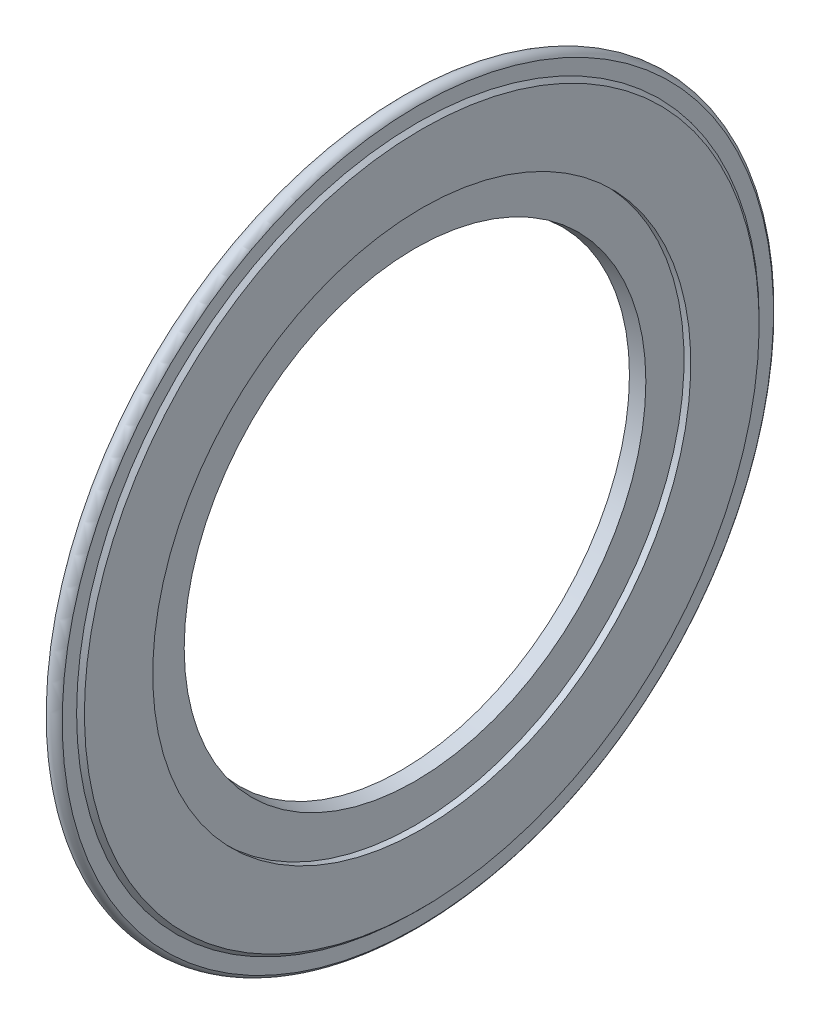
ISO-10303-21;
HEADER;
FILE_DESCRIPTION(('STEP AP214'),'2;1');
FILE_NAME('part.step','',(''),(''),'','','');
FILE_SCHEMA(('AUTOMOTIVE_DESIGN { 1 0 10303 214 1 1 1 1 }'));
ENDSEC;
DATA;
#1=APPLICATION_CONTEXT('core data for automotive mechanical design processes');
#2=APPLICATION_PROTOCOL_DEFINITION('international standard','automotive_design',2000,#1);
#3=PRODUCT_CONTEXT('',#1,'mechanical');
#4=PRODUCT('Part','Part','',(#3));
#5=PRODUCT_RELATED_PRODUCT_CATEGORY('part','',(#4));
#6=PRODUCT_DEFINITION_FORMATION('','',#4);
#7=PRODUCT_DEFINITION_CONTEXT('part definition',#1,'design');
#8=PRODUCT_DEFINITION('design','',#6,#7);
#9=PRODUCT_DEFINITION_SHAPE('','',#8);
#10=(LENGTH_UNIT() NAMED_UNIT(*) SI_UNIT(.MILLI.,.METRE.));
#11=(NAMED_UNIT(*) PLANE_ANGLE_UNIT() SI_UNIT($,.RADIAN.));
#12=(NAMED_UNIT(*) SI_UNIT($,.STERADIAN.) SOLID_ANGLE_UNIT());
#13=UNCERTAINTY_MEASURE_WITH_UNIT(LENGTH_MEASURE(1.E-05),#10,'distance_accuracy_value','');
#14=(GEOMETRIC_REPRESENTATION_CONTEXT(3) GLOBAL_UNCERTAINTY_ASSIGNED_CONTEXT((#13)) GLOBAL_UNIT_ASSIGNED_CONTEXT((#10,
#11,#12)) REPRESENTATION_CONTEXT('',''));
#15=CARTESIAN_POINT('',(0.,0.,0.));
#16=DIRECTION('',(0.,0.,1.));
#17=DIRECTION('',(1.,0.,0.));
#18=AXIS2_PLACEMENT_3D('',#15,#16,#17);
#19=CARTESIAN_POINT('',(9.31,0.,0.));
#20=DIRECTION('',(1.,0.,0.));
#21=DIRECTION('',(0.,1.,0.));
#22=AXIS2_PLACEMENT_3D('',#19,#20,#21);
#23=CONICAL_SURFACE('',#22,10.2102020929528,0.174532925199435);
#24=CARTESIAN_POINT('',(9.,0.,0.));
#25=DIRECTION('',(-1.,0.,0.));
#26=DIRECTION('',(0.,1.,0.));
#27=AXIS2_PLACEMENT_3D('',#24,#25,#26);
#28=CIRCLE('',#27,10.1555407289332);
#29=CARTESIAN_POINT('',(9.,10.1555407289332,0.));
#30=VERTEX_POINT('',#29);
#31=EDGE_CURVE('E11',#30,#30,#28,.T.);
#32=ORIENTED_EDGE('',*,*,#31,.T.);
#33=EDGE_LOOP('',(#32));
#34=FACE_BOUND('',#33,.T.);
#35=CARTESIAN_POINT('',(9.62,0.,0.));
#36=DIRECTION('',(-1.,0.,0.));
#37=DIRECTION('',(0.,1.,0.));
#38=AXIS2_PLACEMENT_3D('',#35,#36,#37);
#39=CIRCLE('',#38,10.2648634569725);
#40=CARTESIAN_POINT('',(9.62,10.2648634569725,0.));
#41=VERTEX_POINT('',#40);
#42=EDGE_CURVE('E87',#41,#41,#39,.T.);
#43=ORIENTED_EDGE('',*,*,#42,.F.);
#44=EDGE_LOOP('',(#43));
#45=FACE_BOUND('',#44,.T.);
#46=ADVANCED_FACE('F17',(#34,#45),#23,.F.);
#47=CARTESIAN_POINT('',(8.84062604111705,0.,0.));
#48=DIRECTION('',(-1.,0.,0.));
#49=DIRECTION('',(0.,1.,0.));
#50=AXIS2_PLACEMENT_3D('',#47,#48,#49);
#51=CONICAL_SURFACE('',#50,11.0593953644666,1.39626340159546);
#52=CARTESIAN_POINT('',(8.6812520822341,0.,0.));
#53=DIRECTION('',(-1.,0.,0.));
#54=DIRECTION('',(0.,1.,0.));
#55=AXIS2_PLACEMENT_3D('',#52,#53,#54);
#56=CIRCLE('',#55,11.96325);
#57=CARTESIAN_POINT('',(8.6812520822341,11.96325,0.));
#58=VERTEX_POINT('',#57);
#59=EDGE_CURVE('E27',#58,#58,#56,.T.);
#60=ORIENTED_EDGE('',*,*,#59,.T.);
#61=EDGE_LOOP('',(#60));
#62=FACE_BOUND('',#61,.T.);
#63=ORIENTED_EDGE('',*,*,#31,.F.);
#64=EDGE_LOOP('',(#63));
#65=FACE_BOUND('',#64,.T.);
#66=ADVANCED_FACE('F109',(#62,#65),#51,.F.);
#67=CARTESIAN_POINT('',(8.54062604111705,0.,0.));
#68=DIRECTION('',(1.,0.,0.));
#69=DIRECTION('',(0.,1.,0.));
#70=AXIS2_PLACEMENT_3D('',#67,#68,#69);
#71=CYLINDRICAL_SURFACE('',#70,11.96325);
#72=CARTESIAN_POINT('',(8.4,0.,0.));
#73=DIRECTION('',(-1.,0.,0.));
#74=DIRECTION('',(0.,1.,0.));
#75=AXIS2_PLACEMENT_3D('',#72,#73,#74);
#76=CIRCLE('',#75,11.96325);
#77=CARTESIAN_POINT('',(8.4,11.96325,0.));
#78=VERTEX_POINT('',#77);
#79=EDGE_CURVE('E71',#78,#78,#76,.T.);
#80=ORIENTED_EDGE('',*,*,#79,.T.);
#81=EDGE_LOOP('',(#80));
#82=FACE_BOUND('',#81,.T.);
#83=ORIENTED_EDGE('',*,*,#59,.F.);
#84=EDGE_LOOP('',(#83));
#85=FACE_BOUND('',#84,.T.);
#86=ADVANCED_FACE('F114',(#82,#85),#71,.F.);
#87=CARTESIAN_POINT('',(8.86,0.,0.));
#88=DIRECTION('',(1.,0.,0.));
#89=DIRECTION('',(0.,1.,0.));
#90=AXIS2_PLACEMENT_3D('',#87,#88,#89);
#91=CONICAL_SURFACE('',#90,12.42325,0.785398163397449);
#92=CARTESIAN_POINT('',(9.32,0.,0.));
#93=DIRECTION('',(-1.,0.,0.));
#94=DIRECTION('',(0.,1.,0.));
#95=AXIS2_PLACEMENT_3D('',#92,#93,#94);
#96=CIRCLE('',#95,12.88325);
#97=CARTESIAN_POINT('',(9.32,12.88325,0.));
#98=VERTEX_POINT('',#97);
#99=EDGE_CURVE('E67',#98,#98,#96,.T.);
#100=ORIENTED_EDGE('',*,*,#99,.T.);
#101=EDGE_LOOP('',(#100));
#102=FACE_BOUND('',#101,.T.);
#103=ORIENTED_EDGE('',*,*,#79,.F.);
#104=EDGE_LOOP('',(#103));
#105=FACE_BOUND('',#104,.T.);
#106=ADVANCED_FACE('F68',(#102,#105),#91,.T.);
#107=CARTESIAN_POINT('',(9.32,13.7679925,0.));
#108=DIRECTION('',(-1.,0.,0.));
#109=DIRECTION('',(0.,1.,0.));
#110=AXIS2_PLACEMENT_3D('',#107,#108,#109);
#111=PLANE('',#110);
#112=CARTESIAN_POINT('',(9.32,0.,0.));
#113=DIRECTION('',(-1.,0.,0.));
#114=DIRECTION('',(0.,1.,0.));
#115=AXIS2_PLACEMENT_3D('',#112,#113,#114);
#116=CIRCLE('',#115,14.652735);
#117=CARTESIAN_POINT('',(9.32,14.652735,0.));
#118=VERTEX_POINT('',#117);
#119=EDGE_CURVE('E21',#118,#118,#116,.T.);
#120=ORIENTED_EDGE('',*,*,#119,.T.);
#121=EDGE_LOOP('',(#120));
#122=FACE_BOUND('',#121,.T.);
#123=ORIENTED_EDGE('',*,*,#99,.F.);
#124=EDGE_LOOP('',(#123));
#125=FACE_BOUND('',#124,.T.);
#126=ADVANCED_FACE('F106',(#122,#125),#111,.T.);
#127=CARTESIAN_POINT('',(9.07202513848292,0.,0.));
#128=DIRECTION('',(1.,0.,0.));
#129=DIRECTION('',(0.,1.,0.));
#130=AXIS2_PLACEMENT_3D('',#127,#128,#129);
#131=CYLINDRICAL_SURFACE('',#130,14.652735);
#132=CARTESIAN_POINT('',(8.82405027696585,0.,0.));
#133=DIRECTION('',(-1.,0.,0.));
#134=DIRECTION('',(0.,1.,0.));
#135=AXIS2_PLACEMENT_3D('',#132,#133,#134);
#136=CIRCLE('',#135,14.652735);
#137=CARTESIAN_POINT('',(8.82405027696585,14.652735,0.));
#138=VERTEX_POINT('',#137);
#139=EDGE_CURVE('E74',#138,#138,#136,.T.);
#140=ORIENTED_EDGE('',*,*,#139,.T.);
#141=EDGE_LOOP('',(#140));
#142=FACE_BOUND('',#141,.T.);
#143=ORIENTED_EDGE('',*,*,#119,.F.);
#144=EDGE_LOOP('',(#143));
#145=FACE_BOUND('',#144,.T.);
#146=ADVANCED_FACE('F92',(#142,#145),#131,.F.);
#147=CARTESIAN_POINT('',(8.91506358788048,0.,0.));
#148=DIRECTION('',(1.,0.,0.));
#149=DIRECTION('',(0.,1.,0.));
#150=AXIS2_PLACEMENT_3D('',#147,#148,#149);
#151=CONICAL_SURFACE('',#150,15.1688971355334,1.39626340159546);
#152=CARTESIAN_POINT('',(9.00607689879512,0.,0.));
#153=DIRECTION('',(-1.,0.,0.));
#154=DIRECTION('',(0.,1.,0.));
#155=AXIS2_PLACEMENT_3D('',#152,#153,#154);
#156=CIRCLE('',#155,15.6850592710668);
#157=CARTESIAN_POINT('',(9.00607689879512,15.6850592710668,0.));
#158=VERTEX_POINT('',#157);
#159=EDGE_CURVE('E82',#158,#158,#156,.T.);
#160=ORIENTED_EDGE('',*,*,#159,.T.);
#161=EDGE_LOOP('',(#160));
#162=FACE_BOUND('',#161,.T.);
#163=ORIENTED_EDGE('',*,*,#139,.F.);
#164=EDGE_LOOP('',(#163));
#165=FACE_BOUND('',#164,.T.);
#166=ADVANCED_FACE('F19',(#162,#165),#151,.T.);
#167=CARTESIAN_POINT('',(9.4,0.,0.));
#168=DIRECTION('',(-1.,0.,0.));
#169=DIRECTION('',(0.,0.,1.));
#170=AXIS2_PLACEMENT_3D('',#167,#168,#169);
#171=TOROIDAL_SURFACE('',#170,15.6156,0.4);
#172=CARTESIAN_POINT('',(9.74641016151378,0.,0.));
#173=DIRECTION('',(-1.,0.,0.));
#174=DIRECTION('',(0.,1.,0.));
#175=AXIS2_PLACEMENT_3D('',#172,#173,#174);
#176=CIRCLE('',#175,15.8156);
#177=CARTESIAN_POINT('',(9.74641016151378,15.8156,0.));
#178=VERTEX_POINT('',#177);
#179=EDGE_CURVE('E81',#178,#178,#176,.T.);
#180=ORIENTED_EDGE('',*,*,#179,.T.);
#181=EDGE_LOOP('',(#180));
#182=FACE_BOUND('',#181,.T.);
#183=ORIENTED_EDGE('',*,*,#159,.F.);
#184=EDGE_LOOP('',(#183));
#185=FACE_BOUND('',#184,.T.);
#186=ADVANCED_FACE('F96',(#182,#185),#171,.T.);
#187=CARTESIAN_POINT('',(9.74641016151378,15.4956,0.));
#188=DIRECTION('',(1.,0.,0.));
#189=DIRECTION('',(0.,-1.,0.));
#190=AXIS2_PLACEMENT_3D('',#187,#188,#189);
#191=PLANE('',#190);
#192=CARTESIAN_POINT('',(9.74641016151378,0.,0.));
#193=DIRECTION('',(-1.,0.,0.));
#194=DIRECTION('',(0.,1.,0.));
#195=AXIS2_PLACEMENT_3D('',#192,#193,#194);
#196=CIRCLE('',#195,15.1756);
#197=CARTESIAN_POINT('',(9.74641016151378,15.1756,0.));
#198=VERTEX_POINT('',#197);
#199=EDGE_CURVE('E79',#198,#198,#196,.T.);
#200=ORIENTED_EDGE('',*,*,#199,.T.);
#201=EDGE_LOOP('',(#200));
#202=FACE_BOUND('',#201,.T.);
#203=ORIENTED_EDGE('',*,*,#179,.F.);
#204=EDGE_LOOP('',(#203));
#205=FACE_BOUND('',#204,.T.);
#206=ADVANCED_FACE('F103',(#202,#205),#191,.T.);
#207=CARTESIAN_POINT('',(9.83320508075689,0.,0.));
#208=DIRECTION('',(-1.,0.,0.));
#209=DIRECTION('',(0.,1.,0.));
#210=AXIS2_PLACEMENT_3D('',#207,#208,#209);
#211=CONICAL_SURFACE('',#210,15.0888050807569,0.785398163397439);
#212=CARTESIAN_POINT('',(9.92,0.,0.));
#213=DIRECTION('',(-1.,0.,0.));
#214=DIRECTION('',(0.,1.,0.));
#215=AXIS2_PLACEMENT_3D('',#212,#213,#214);
#216=CIRCLE('',#215,15.0020101615138);
#217=CARTESIAN_POINT('',(9.92,15.0020101615138,0.));
#218=VERTEX_POINT('',#217);
#219=EDGE_CURVE('E77',#218,#218,#216,.T.);
#220=ORIENTED_EDGE('',*,*,#219,.T.);
#221=EDGE_LOOP('',(#220));
#222=FACE_BOUND('',#221,.T.);
#223=ORIENTED_EDGE('',*,*,#199,.F.);
#224=EDGE_LOOP('',(#223));
#225=FACE_BOUND('',#224,.T.);
#226=ADVANCED_FACE('F174',(#222,#225),#211,.T.);
#227=CARTESIAN_POINT('',(9.92,13.4826300807569,0.));
#228=DIRECTION('',(1.,0.,0.));
#229=DIRECTION('',(0.,-1.,0.));
#230=AXIS2_PLACEMENT_3D('',#227,#228,#229);
#231=PLANE('',#230);
#232=CARTESIAN_POINT('',(9.92,0.,0.));
#233=DIRECTION('',(-1.,0.,0.));
#234=DIRECTION('',(0.,1.,0.));
#235=AXIS2_PLACEMENT_3D('',#232,#233,#234);
#236=CIRCLE('',#235,11.96325);
#237=CARTESIAN_POINT('',(9.92,11.96325,0.));
#238=VERTEX_POINT('',#237);
#239=EDGE_CURVE('E88',#238,#238,#236,.T.);
#240=ORIENTED_EDGE('',*,*,#239,.T.);
#241=EDGE_LOOP('',(#240));
#242=FACE_BOUND('',#241,.T.);
#243=ORIENTED_EDGE('',*,*,#219,.F.);
#244=EDGE_LOOP('',(#243));
#245=FACE_BOUND('',#244,.T.);
#246=ADVANCED_FACE('F184',(#242,#245),#231,.T.);
#247=CARTESIAN_POINT('',(9.77,0.,0.));
#248=DIRECTION('',(1.,0.,0.));
#249=DIRECTION('',(0.,1.,0.));
#250=AXIS2_PLACEMENT_3D('',#247,#248,#249);
#251=CYLINDRICAL_SURFACE('',#250,11.96325);
#252=CARTESIAN_POINT('',(9.62,0.,0.));
#253=DIRECTION('',(-1.,0.,0.));
#254=DIRECTION('',(0.,1.,0.));
#255=AXIS2_PLACEMENT_3D('',#252,#253,#254);
#256=CIRCLE('',#255,11.96325);
#257=CARTESIAN_POINT('',(9.62,11.96325,0.));
#258=VERTEX_POINT('',#257);
#259=EDGE_CURVE('E89',#258,#258,#256,.T.);
#260=ORIENTED_EDGE('',*,*,#259,.T.);
#261=EDGE_LOOP('',(#260));
#262=FACE_BOUND('',#261,.T.);
#263=ORIENTED_EDGE('',*,*,#239,.F.);
#264=EDGE_LOOP('',(#263));
#265=FACE_BOUND('',#264,.T.);
#266=ADVANCED_FACE('F126',(#262,#265),#251,.F.);
#267=CARTESIAN_POINT('',(9.62,11.1140567284862,0.));
#268=DIRECTION('',(1.,0.,0.));
#269=DIRECTION('',(0.,-1.,0.));
#270=AXIS2_PLACEMENT_3D('',#267,#268,#269);
#271=PLANE('',#270);
#272=ORIENTED_EDGE('',*,*,#42,.T.);
#273=EDGE_LOOP('',(#272));
#274=FACE_BOUND('',#273,.T.);
#275=ORIENTED_EDGE('',*,*,#259,.F.);
#276=EDGE_LOOP('',(#275));
#277=FACE_BOUND('',#276,.T.);
#278=ADVANCED_FACE('F124',(#274,#277),#271,.T.);
#279=CLOSED_SHELL('',(#46,#66,#86,#106,#126,#146,#166,#186,#206,#226,#246,#266,#278));
#280=MANIFOLD_SOLID_BREP('B1',#279);
#281=ADVANCED_BREP_SHAPE_REPRESENTATION('',(#18,#280),#14);
#282=SHAPE_DEFINITION_REPRESENTATION(#9,#281);
ENDSEC;
END-ISO-10303-21;
